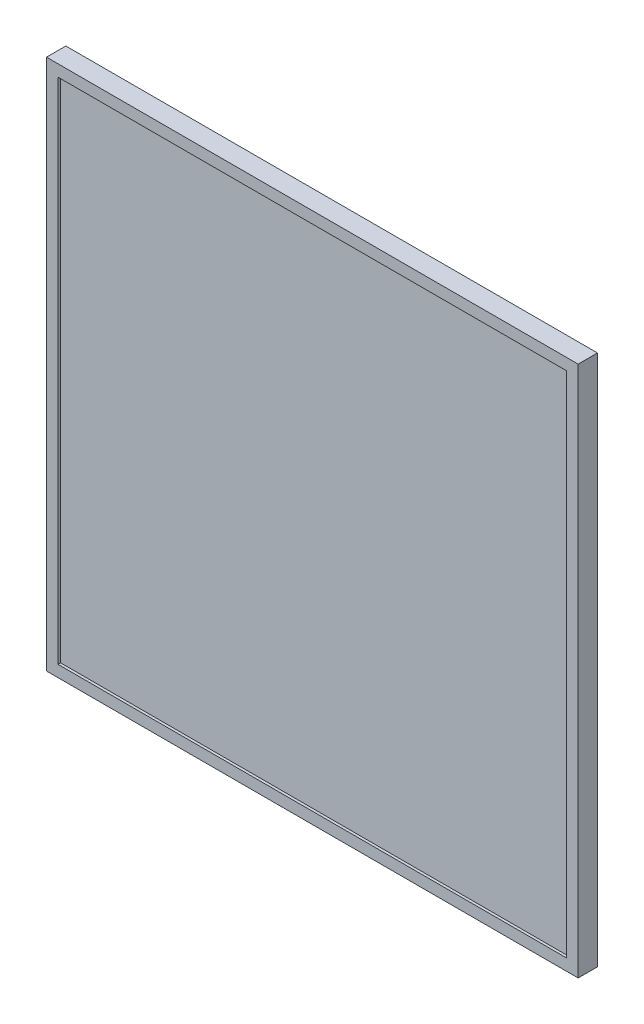
ISO-10303-21;
HEADER;
FILE_DESCRIPTION(('STEP AP214'),'2;1');
FILE_NAME('part.step','',(''),(''),'','','');
FILE_SCHEMA(('AUTOMOTIVE_DESIGN { 1 0 10303 214 1 1 1 1 }'));
ENDSEC;
DATA;
#1=APPLICATION_CONTEXT('core data for automotive mechanical design processes');
#2=APPLICATION_PROTOCOL_DEFINITION('international standard','automotive_design',2000,#1);
#3=PRODUCT_CONTEXT('',#1,'mechanical');
#4=PRODUCT('Part','Part','',(#3));
#5=PRODUCT_RELATED_PRODUCT_CATEGORY('part','',(#4));
#6=PRODUCT_DEFINITION_FORMATION('','',#4);
#7=PRODUCT_DEFINITION_CONTEXT('part definition',#1,'design');
#8=PRODUCT_DEFINITION('design','',#6,#7);
#9=PRODUCT_DEFINITION_SHAPE('','',#8);
#10=(LENGTH_UNIT() NAMED_UNIT(*) SI_UNIT(.MILLI.,.METRE.));
#11=(NAMED_UNIT(*) PLANE_ANGLE_UNIT() SI_UNIT($,.RADIAN.));
#12=(NAMED_UNIT(*) SI_UNIT($,.STERADIAN.) SOLID_ANGLE_UNIT());
#13=UNCERTAINTY_MEASURE_WITH_UNIT(LENGTH_MEASURE(1.E-05),#10,'distance_accuracy_value','');
#14=(GEOMETRIC_REPRESENTATION_CONTEXT(3) GLOBAL_UNCERTAINTY_ASSIGNED_CONTEXT((#13)) GLOBAL_UNIT_ASSIGNED_CONTEXT((#10,
#11,#12)) REPRESENTATION_CONTEXT('',''));
#15=CARTESIAN_POINT('',(0.,0.,0.));
#16=DIRECTION('',(0.,0.,1.));
#17=DIRECTION('',(1.,0.,0.));
#18=AXIS2_PLACEMENT_3D('',#15,#16,#17);
#19=CARTESIAN_POINT('',(0.,0.,15.));
#20=DIRECTION('',(1.,0.,0.));
#21=DIRECTION('',(0.,1.,0.));
#22=AXIS2_PLACEMENT_3D('',#19,#20,#21);
#23=PLANE('',#22);
#24=DIRECTION('',(0.,-1.,0.));
#25=VECTOR('',#24,1.);
#26=CARTESIAN_POINT('',(0.,0.,0.));
#27=LINE('',#26,#25);
#28=CARTESIAN_POINT('',(0.,0.,0.));
#29=VERTEX_POINT('',#28);
#30=CARTESIAN_POINT('',(0.,-412.5,0.));
#31=VERTEX_POINT('',#30);
#32=EDGE_CURVE('E190',#29,#31,#27,.T.);
#33=ORIENTED_EDGE('',*,*,#32,.T.);
#34=DIRECTION('',(0.,0.,-1.));
#35=VECTOR('',#34,1.);
#36=CARTESIAN_POINT('',(0.,-412.5,15.));
#37=LINE('',#36,#35);
#38=CARTESIAN_POINT('',(0.,-412.5,15.));
#39=VERTEX_POINT('',#38);
#40=EDGE_CURVE('E11',#39,#31,#37,.T.);
#41=ORIENTED_EDGE('',*,*,#40,.F.);
#42=DIRECTION('',(0.,-1.,0.));
#43=VECTOR('',#42,1.);
#44=CARTESIAN_POINT('',(0.,0.,15.));
#45=LINE('',#44,#43);
#46=CARTESIAN_POINT('',(0.,0.,15.));
#47=VERTEX_POINT('',#46);
#48=EDGE_CURVE('E191',#47,#39,#45,.T.);
#49=ORIENTED_EDGE('',*,*,#48,.F.);
#50=DIRECTION('',(0.,0.,-1.));
#51=VECTOR('',#50,1.);
#52=CARTESIAN_POINT('',(0.,0.,15.));
#53=LINE('',#52,#51);
#54=EDGE_CURVE('E201',#47,#29,#53,.T.);
#55=ORIENTED_EDGE('',*,*,#54,.T.);
#56=EDGE_LOOP('',(#33,#41,#49,#55));
#57=FACE_BOUND('',#56,.T.);
#58=ADVANCED_FACE('F44',(#57),#23,.F.);
#59=CARTESIAN_POINT('',(0.,-412.5,15.));
#60=DIRECTION('',(0.,1.,0.));
#61=DIRECTION('',(0.,0.,1.));
#62=AXIS2_PLACEMENT_3D('',#59,#60,#61);
#63=PLANE('',#62);
#64=DIRECTION('',(1.,0.,0.));
#65=VECTOR('',#64,1.);
#66=CARTESIAN_POINT('',(0.,-412.5,0.));
#67=LINE('',#66,#65);
#68=CARTESIAN_POINT('',(412.5,-412.5,0.));
#69=VERTEX_POINT('',#68);
#70=EDGE_CURVE('E206',#31,#69,#67,.T.);
#71=ORIENTED_EDGE('',*,*,#70,.T.);
#72=DIRECTION('',(0.,0.,-1.));
#73=VECTOR('',#72,1.);
#74=CARTESIAN_POINT('',(412.5,-412.5,15.));
#75=LINE('',#74,#73);
#76=CARTESIAN_POINT('',(412.5,-412.5,15.));
#77=VERTEX_POINT('',#76);
#78=EDGE_CURVE('E55',#77,#69,#75,.T.);
#79=ORIENTED_EDGE('',*,*,#78,.F.);
#80=DIRECTION('',(1.,0.,0.));
#81=VECTOR('',#80,1.);
#82=CARTESIAN_POINT('',(0.,-412.5,15.));
#83=LINE('',#82,#81);
#84=EDGE_CURVE('E198',#39,#77,#83,.T.);
#85=ORIENTED_EDGE('',*,*,#84,.F.);
#86=ORIENTED_EDGE('',*,*,#40,.T.);
#87=EDGE_LOOP('',(#71,#79,#85,#86));
#88=FACE_BOUND('',#87,.T.);
#89=ADVANCED_FACE('F234',(#88),#63,.F.);
#90=CARTESIAN_POINT('',(412.5,0.,15.));
#91=DIRECTION('',(-1.,0.,0.));
#92=DIRECTION('',(0.,-1.,0.));
#93=AXIS2_PLACEMENT_3D('',#90,#91,#92);
#94=PLANE('',#93);
#95=DIRECTION('',(0.,1.,0.));
#96=VECTOR('',#95,1.);
#97=CARTESIAN_POINT('',(412.5,0.,0.));
#98=LINE('',#97,#96);
#99=CARTESIAN_POINT('',(412.5,0.,0.));
#100=VERTEX_POINT('',#99);
#101=EDGE_CURVE('E208',#69,#100,#98,.T.);
#102=ORIENTED_EDGE('',*,*,#101,.T.);
#103=DIRECTION('',(0.,0.,-1.));
#104=VECTOR('',#103,1.);
#105=CARTESIAN_POINT('',(412.5,0.,15.));
#106=LINE('',#105,#104);
#107=CARTESIAN_POINT('',(412.5,0.,15.));
#108=VERTEX_POINT('',#107);
#109=EDGE_CURVE('E213',#108,#100,#106,.T.);
#110=ORIENTED_EDGE('',*,*,#109,.F.);
#111=DIRECTION('',(0.,1.,0.));
#112=VECTOR('',#111,1.);
#113=CARTESIAN_POINT('',(412.5,0.,15.));
#114=LINE('',#113,#112);
#115=EDGE_CURVE('E200',#77,#108,#114,.T.);
#116=ORIENTED_EDGE('',*,*,#115,.F.);
#117=ORIENTED_EDGE('',*,*,#78,.T.);
#118=EDGE_LOOP('',(#102,#110,#116,#117));
#119=FACE_BOUND('',#118,.T.);
#120=ADVANCED_FACE('F219',(#119),#94,.F.);
#121=CARTESIAN_POINT('',(0.,0.,15.));
#122=DIRECTION('',(0.,-1.,0.));
#123=DIRECTION('',(0.,0.,-1.));
#124=AXIS2_PLACEMENT_3D('',#121,#122,#123);
#125=PLANE('',#124);
#126=DIRECTION('',(-1.,0.,0.));
#127=VECTOR('',#126,1.);
#128=CARTESIAN_POINT('',(0.,0.,0.));
#129=LINE('',#128,#127);
#130=EDGE_CURVE('E197',#100,#29,#129,.T.);
#131=ORIENTED_EDGE('',*,*,#130,.T.);
#132=ORIENTED_EDGE('',*,*,#54,.F.);
#133=DIRECTION('',(-1.,0.,0.));
#134=VECTOR('',#133,1.);
#135=CARTESIAN_POINT('',(0.,0.,15.));
#136=LINE('',#135,#134);
#137=EDGE_CURVE('E203',#108,#47,#136,.T.);
#138=ORIENTED_EDGE('',*,*,#137,.F.);
#139=ORIENTED_EDGE('',*,*,#109,.T.);
#140=EDGE_LOOP('',(#131,#132,#138,#139));
#141=FACE_BOUND('',#140,.T.);
#142=ADVANCED_FACE('F230',(#141),#125,.F.);
#143=CARTESIAN_POINT('',(0.,0.,15.));
#144=DIRECTION('',(0.,0.,1.));
#145=DIRECTION('',(1.,0.,0.));
#146=AXIS2_PLACEMENT_3D('',#143,#144,#145);
#147=PLANE('',#146);
#148=DIRECTION('',(0.,-1.,0.));
#149=VECTOR('',#148,1.);
#150=CARTESIAN_POINT('',(8.97,-8.97,15.));
#151=LINE('',#150,#149);
#152=CARTESIAN_POINT('',(8.97,-8.97,15.));
#153=VERTEX_POINT('',#152);
#154=CARTESIAN_POINT('',(8.97000000000005,-403.53,15.));
#155=VERTEX_POINT('',#154);
#156=EDGE_CURVE('E70',#153,#155,#151,.T.);
#157=ORIENTED_EDGE('',*,*,#156,.F.);
#158=DIRECTION('',(-1.,0.,0.));
#159=VECTOR('',#158,1.);
#160=CARTESIAN_POINT('',(8.97,-8.97,15.));
#161=LINE('',#160,#159);
#162=CARTESIAN_POINT('',(403.53,-8.97,15.));
#163=VERTEX_POINT('',#162);
#164=EDGE_CURVE('E169',#163,#153,#161,.T.);
#165=ORIENTED_EDGE('',*,*,#164,.F.);
#166=DIRECTION('',(0.,1.,0.));
#167=VECTOR('',#166,1.);
#168=CARTESIAN_POINT('',(403.53,-8.97,15.));
#169=LINE('',#168,#167);
#170=CARTESIAN_POINT('',(403.53,-403.53,15.));
#171=VERTEX_POINT('',#170);
#172=EDGE_CURVE('E177',#171,#163,#169,.T.);
#173=ORIENTED_EDGE('',*,*,#172,.F.);
#174=DIRECTION('',(1.,0.,0.));
#175=VECTOR('',#174,1.);
#176=CARTESIAN_POINT('',(8.97000000000005,-403.53,15.));
#177=LINE('',#176,#175);
#178=EDGE_CURVE('E158',#155,#171,#177,.T.);
#179=ORIENTED_EDGE('',*,*,#178,.F.);
#180=EDGE_LOOP('',(#157,#165,#173,#179));
#181=FACE_BOUND('',#180,.T.);
#182=ORIENTED_EDGE('',*,*,#48,.T.);
#183=ORIENTED_EDGE('',*,*,#84,.T.);
#184=ORIENTED_EDGE('',*,*,#115,.T.);
#185=ORIENTED_EDGE('',*,*,#137,.T.);
#186=EDGE_LOOP('',(#182,#183,#184,#185));
#187=FACE_BOUND('',#186,.T.);
#188=ADVANCED_FACE('F231',(#181,#187),#147,.T.);
#189=CARTESIAN_POINT('',(0.,0.,0.));
#190=DIRECTION('',(0.,0.,1.));
#191=DIRECTION('',(1.,0.,0.));
#192=AXIS2_PLACEMENT_3D('',#189,#190,#191);
#193=PLANE('',#192);
#194=DIRECTION('',(-1.,0.,0.));
#195=VECTOR('',#194,1.);
#196=CARTESIAN_POINT('',(256.25,-206.25,0.));
#197=LINE('',#196,#195);
#198=CARTESIAN_POINT('',(256.25,-206.25,0.));
#199=VERTEX_POINT('',#198);
#200=CARTESIAN_POINT('',(156.25,-206.25,0.));
#201=VERTEX_POINT('',#200);
#202=EDGE_CURVE('E382',#199,#201,#197,.T.);
#203=ORIENTED_EDGE('',*,*,#202,.T.);
#204=DIRECTION('',(0.,-1.,0.));
#205=VECTOR('',#204,1.);
#206=CARTESIAN_POINT('',(156.25,-235.33717788856,0.));
#207=LINE('',#206,#205);
#208=CARTESIAN_POINT('',(156.25,-235.33717788856,0.));
#209=VERTEX_POINT('',#208);
#210=EDGE_CURVE('E56',#201,#209,#207,.T.);
#211=ORIENTED_EDGE('',*,*,#210,.T.);
#212=DIRECTION('',(-1.,0.,0.));
#213=VECTOR('',#212,1.);
#214=CARTESIAN_POINT('',(256.25,-235.33717788856,0.));
#215=LINE('',#214,#213);
#216=CARTESIAN_POINT('',(256.25,-235.33717788856,0.));
#217=VERTEX_POINT('',#216);
#218=EDGE_CURVE('E136',#217,#209,#215,.T.);
#219=ORIENTED_EDGE('',*,*,#218,.F.);
#220=DIRECTION('',(0.,-1.,0.));
#221=VECTOR('',#220,1.);
#222=CARTESIAN_POINT('',(256.25,-235.33717788856,0.));
#223=LINE('',#222,#221);
#224=EDGE_CURVE('E145',#199,#217,#223,.T.);
#225=ORIENTED_EDGE('',*,*,#224,.F.);
#226=EDGE_LOOP('',(#203,#211,#219,#225));
#227=FACE_BOUND('',#226,.T.);
#228=ORIENTED_EDGE('',*,*,#32,.F.);
#229=ORIENTED_EDGE('',*,*,#130,.F.);
#230=ORIENTED_EDGE('',*,*,#101,.F.);
#231=ORIENTED_EDGE('',*,*,#70,.F.);
#232=EDGE_LOOP('',(#228,#229,#230,#231));
#233=FACE_BOUND('',#232,.T.);
#234=ADVANCED_FACE('F154',(#227,#233),#193,.F.);
#235=CARTESIAN_POINT('',(8.97,-8.97,13.));
#236=DIRECTION('',(-1.,0.,0.));
#237=DIRECTION('',(0.,-1.,0.));
#238=AXIS2_PLACEMENT_3D('',#235,#236,#237);
#239=PLANE('',#238);
#240=ORIENTED_EDGE('',*,*,#156,.T.);
#241=DIRECTION('',(0.,0.,1.));
#242=VECTOR('',#241,1.);
#243=CARTESIAN_POINT('',(8.97000000000005,-403.53,13.));
#244=LINE('',#243,#242);
#245=CARTESIAN_POINT('',(8.97000000000005,-403.53,13.));
#246=VERTEX_POINT('',#245);
#247=EDGE_CURVE('E178',#246,#155,#244,.T.);
#248=ORIENTED_EDGE('',*,*,#247,.F.);
#249=DIRECTION('',(0.,-1.,0.));
#250=VECTOR('',#249,1.);
#251=CARTESIAN_POINT('',(8.97,-8.97,13.));
#252=LINE('',#251,#250);
#253=CARTESIAN_POINT('',(8.97,-8.97,13.));
#254=VERTEX_POINT('',#253);
#255=EDGE_CURVE('E163',#254,#246,#252,.T.);
#256=ORIENTED_EDGE('',*,*,#255,.F.);
#257=DIRECTION('',(0.,0.,1.));
#258=VECTOR('',#257,1.);
#259=CARTESIAN_POINT('',(8.97,-8.97,13.));
#260=LINE('',#259,#258);
#261=EDGE_CURVE('E183',#254,#153,#260,.T.);
#262=ORIENTED_EDGE('',*,*,#261,.T.);
#263=EDGE_LOOP('',(#240,#248,#256,#262));
#264=FACE_BOUND('',#263,.T.);
#265=ADVANCED_FACE('F248',(#264),#239,.F.);
#266=CARTESIAN_POINT('',(8.97,-8.97,13.));
#267=DIRECTION('',(0.,1.,0.));
#268=DIRECTION('',(0.,0.,1.));
#269=AXIS2_PLACEMENT_3D('',#266,#267,#268);
#270=PLANE('',#269);
#271=ORIENTED_EDGE('',*,*,#164,.T.);
#272=ORIENTED_EDGE('',*,*,#261,.F.);
#273=DIRECTION('',(-1.,0.,0.));
#274=VECTOR('',#273,1.);
#275=CARTESIAN_POINT('',(8.97,-8.97,13.));
#276=LINE('',#275,#274);
#277=CARTESIAN_POINT('',(403.53,-8.97,13.));
#278=VERTEX_POINT('',#277);
#279=EDGE_CURVE('E171',#278,#254,#276,.T.);
#280=ORIENTED_EDGE('',*,*,#279,.F.);
#281=DIRECTION('',(0.,0.,1.));
#282=VECTOR('',#281,1.);
#283=CARTESIAN_POINT('',(403.53,-8.97,13.));
#284=LINE('',#283,#282);
#285=EDGE_CURVE('E189',#278,#163,#284,.T.);
#286=ORIENTED_EDGE('',*,*,#285,.T.);
#287=EDGE_LOOP('',(#271,#272,#280,#286));
#288=FACE_BOUND('',#287,.T.);
#289=ADVANCED_FACE('F252',(#288),#270,.F.);
#290=CARTESIAN_POINT('',(403.53,-8.97,13.));
#291=DIRECTION('',(1.,0.,0.));
#292=DIRECTION('',(0.,1.,0.));
#293=AXIS2_PLACEMENT_3D('',#290,#291,#292);
#294=PLANE('',#293);
#295=ORIENTED_EDGE('',*,*,#172,.T.);
#296=ORIENTED_EDGE('',*,*,#285,.F.);
#297=DIRECTION('',(0.,1.,0.));
#298=VECTOR('',#297,1.);
#299=CARTESIAN_POINT('',(403.53,-8.97,13.));
#300=LINE('',#299,#298);
#301=CARTESIAN_POINT('',(403.53,-403.53,13.));
#302=VERTEX_POINT('',#301);
#303=EDGE_CURVE('E172',#302,#278,#300,.T.);
#304=ORIENTED_EDGE('',*,*,#303,.F.);
#305=DIRECTION('',(0.,0.,1.));
#306=VECTOR('',#305,1.);
#307=CARTESIAN_POINT('',(403.53,-403.53,13.));
#308=LINE('',#307,#306);
#309=EDGE_CURVE('E188',#302,#171,#308,.T.);
#310=ORIENTED_EDGE('',*,*,#309,.T.);
#311=EDGE_LOOP('',(#295,#296,#304,#310));
#312=FACE_BOUND('',#311,.T.);
#313=ADVANCED_FACE('F260',(#312),#294,.F.);
#314=CARTESIAN_POINT('',(8.97000000000005,-403.53,13.));
#315=DIRECTION('',(0.,-1.,0.));
#316=DIRECTION('',(0.,0.,-1.));
#317=AXIS2_PLACEMENT_3D('',#314,#315,#316);
#318=PLANE('',#317);
#319=ORIENTED_EDGE('',*,*,#178,.T.);
#320=ORIENTED_EDGE('',*,*,#309,.F.);
#321=DIRECTION('',(1.,0.,0.));
#322=VECTOR('',#321,1.);
#323=CARTESIAN_POINT('',(8.97000000000005,-403.53,13.));
#324=LINE('',#323,#322);
#325=EDGE_CURVE('E170',#246,#302,#324,.T.);
#326=ORIENTED_EDGE('',*,*,#325,.F.);
#327=ORIENTED_EDGE('',*,*,#247,.T.);
#328=EDGE_LOOP('',(#319,#320,#326,#327));
#329=FACE_BOUND('',#328,.T.);
#330=ADVANCED_FACE('F251',(#329),#318,.F.);
#331=CARTESIAN_POINT('',(0.,0.,13.));
#332=DIRECTION('',(0.,0.,1.));
#333=DIRECTION('',(1.,0.,0.));
#334=AXIS2_PLACEMENT_3D('',#331,#332,#333);
#335=PLANE('',#334);
#336=ORIENTED_EDGE('',*,*,#255,.T.);
#337=ORIENTED_EDGE('',*,*,#325,.T.);
#338=ORIENTED_EDGE('',*,*,#303,.T.);
#339=ORIENTED_EDGE('',*,*,#279,.T.);
#340=EDGE_LOOP('',(#336,#337,#338,#339));
#341=FACE_BOUND('',#340,.T.);
#342=ADVANCED_FACE('F258',(#341),#335,.T.);
#343=CARTESIAN_POINT('',(256.25,-368.119079257124,-125.73909545349));
#344=DIRECTION('',(0.,0.687588190116786,-0.726100875093759));
#345=DIRECTION('',(0.,0.726100875093759,0.687588190116786));
#346=AXIS2_PLACEMENT_3D('',#343,#344,#345);
#347=PLANE('',#346);
#348=DIRECTION('',(0.,-0.726100875093759,-0.687588190116786));
#349=VECTOR('',#348,1.);
#350=CARTESIAN_POINT('',(156.25,-368.119079257124,-125.73909545349));
#351=LINE('',#350,#349);
#352=CARTESIAN_POINT('',(156.25,-368.119079257124,-125.73909545349));
#353=VERTEX_POINT('',#352);
#354=EDGE_CURVE('E395',#209,#353,#351,.T.);
#355=ORIENTED_EDGE('',*,*,#354,.T.);
#356=DIRECTION('',(-1.,0.,0.));
#357=VECTOR('',#356,1.);
#358=CARTESIAN_POINT('',(256.25,-368.119079257124,-125.73909545349));
#359=LINE('',#358,#357);
#360=CARTESIAN_POINT('',(256.25,-368.119079257124,-125.73909545349));
#361=VERTEX_POINT('',#360);
#362=EDGE_CURVE('E137',#361,#353,#359,.T.);
#363=ORIENTED_EDGE('',*,*,#362,.F.);
#364=DIRECTION('',(0.,-0.726100875093759,-0.687588190116786));
#365=VECTOR('',#364,1.);
#366=CARTESIAN_POINT('',(256.25,-368.119079257124,-125.73909545349));
#367=LINE('',#366,#365);
#368=EDGE_CURVE('E131',#217,#361,#367,.T.);
#369=ORIENTED_EDGE('',*,*,#368,.F.);
#370=ORIENTED_EDGE('',*,*,#218,.T.);
#371=EDGE_LOOP('',(#355,#363,#369,#370));
#372=FACE_BOUND('',#371,.T.);
#373=ADVANCED_FACE('F138',(#372),#347,.F.);
#374=CARTESIAN_POINT('',(256.25,-368.119079257124,-125.73909545349));
#375=DIRECTION('',(0.,0.941115019956237,0.338086555800096));
#376=DIRECTION('',(0.,-0.338086555800096,0.941115019956237));
#377=AXIS2_PLACEMENT_3D('',#374,#375,#376);
#378=PLANE('',#377);
#379=DIRECTION('',(0.,0.338086555800096,-0.941115019956237));
#380=VECTOR('',#379,1.);
#381=CARTESIAN_POINT('',(156.25,-368.119079257124,-125.73909545349));
#382=LINE('',#381,#380);
#383=CARTESIAN_POINT('',(156.25,-360.735735274802,-146.291749204607));
#384=VERTEX_POINT('',#383);
#385=EDGE_CURVE('E387',#353,#384,#382,.T.);
#386=ORIENTED_EDGE('',*,*,#385,.T.);
#387=DIRECTION('',(-1.,0.,0.));
#388=VECTOR('',#387,1.);
#389=CARTESIAN_POINT('',(256.25,-360.735735274802,-146.291749204607));
#390=LINE('',#389,#388);
#391=CARTESIAN_POINT('',(256.25,-360.735735274802,-146.291749204607));
#392=VERTEX_POINT('',#391);
#393=EDGE_CURVE('E159',#392,#384,#390,.T.);
#394=ORIENTED_EDGE('',*,*,#393,.F.);
#395=DIRECTION('',(0.,0.338086555800096,-0.941115019956237));
#396=VECTOR('',#395,1.);
#397=CARTESIAN_POINT('',(256.25,-368.119079257124,-125.73909545349));
#398=LINE('',#397,#396);
#399=EDGE_CURVE('E141',#361,#392,#398,.T.);
#400=ORIENTED_EDGE('',*,*,#399,.F.);
#401=ORIENTED_EDGE('',*,*,#362,.T.);
#402=EDGE_LOOP('',(#386,#394,#400,#401));
#403=FACE_BOUND('',#402,.T.);
#404=ADVANCED_FACE('F269',(#403),#378,.F.);
#405=CARTESIAN_POINT('',(256.25,-206.25,0.));
#406=DIRECTION('',(0.,-0.687588190116786,0.726100875093759));
#407=DIRECTION('',(0.,-0.726100875093759,-0.687588190116786));
#408=AXIS2_PLACEMENT_3D('',#405,#406,#407);
#409=PLANE('',#408);
#410=DIRECTION('',(0.,0.726100875093759,0.687588190116786));
#411=VECTOR('',#410,1.);
#412=CARTESIAN_POINT('',(156.25,-206.25,0.));
#413=LINE('',#412,#411);
#414=EDGE_CURVE('E153',#384,#201,#413,.T.);
#415=ORIENTED_EDGE('',*,*,#414,.T.);
#416=ORIENTED_EDGE('',*,*,#202,.F.);
#417=DIRECTION('',(0.,0.726100875093759,0.687588190116786));
#418=VECTOR('',#417,1.);
#419=CARTESIAN_POINT('',(256.25,-206.25,0.));
#420=LINE('',#419,#418);
#421=EDGE_CURVE('E149',#392,#199,#420,.T.);
#422=ORIENTED_EDGE('',*,*,#421,.F.);
#423=ORIENTED_EDGE('',*,*,#393,.T.);
#424=EDGE_LOOP('',(#415,#416,#422,#423));
#425=FACE_BOUND('',#424,.T.);
#426=ADVANCED_FACE('F272',(#425),#409,.F.);
#427=CARTESIAN_POINT('',(256.25,0.,0.));
#428=DIRECTION('',(-1.,0.,0.));
#429=DIRECTION('',(0.,0.,1.));
#430=AXIS2_PLACEMENT_3D('',#427,#428,#429);
#431=PLANE('',#430);
#432=ORIENTED_EDGE('',*,*,#224,.T.);
#433=ORIENTED_EDGE('',*,*,#368,.T.);
#434=ORIENTED_EDGE('',*,*,#399,.T.);
#435=ORIENTED_EDGE('',*,*,#421,.T.);
#436=EDGE_LOOP('',(#432,#433,#434,#435));
#437=FACE_BOUND('',#436,.T.);
#438=ADVANCED_FACE('F150',(#437),#431,.F.);
#439=CARTESIAN_POINT('',(156.25,0.,0.));
#440=DIRECTION('',(-1.,0.,0.));
#441=DIRECTION('',(0.,0.,1.));
#442=AXIS2_PLACEMENT_3D('',#439,#440,#441);
#443=PLANE('',#442);
#444=ORIENTED_EDGE('',*,*,#210,.F.);
#445=ORIENTED_EDGE('',*,*,#414,.F.);
#446=ORIENTED_EDGE('',*,*,#385,.F.);
#447=ORIENTED_EDGE('',*,*,#354,.F.);
#448=EDGE_LOOP('',(#444,#445,#446,#447));
#449=FACE_BOUND('',#448,.T.);
#450=ADVANCED_FACE('F279',(#449),#443,.T.);
#451=CLOSED_SHELL('',(#58,#89,#120,#142,#188,#234,#265,#289,#313,#330,#342,#373,#404,#426,#438,#450));
#452=MANIFOLD_SOLID_BREP('B2',#451);
#453=ADVANCED_BREP_SHAPE_REPRESENTATION('',(#18,#452),#14);
#454=SHAPE_DEFINITION_REPRESENTATION(#9,#453);
ENDSEC;
END-ISO-10303-21;
